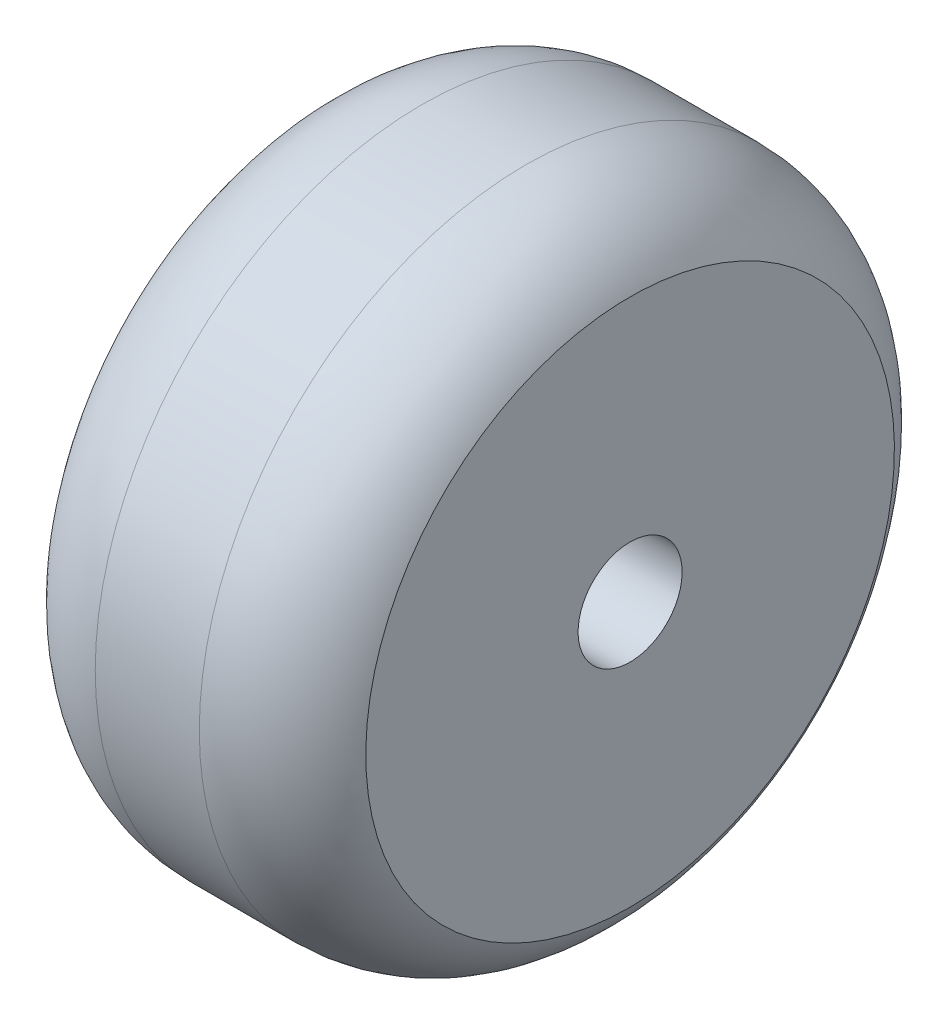
ISO-10303-21;
HEADER;
FILE_DESCRIPTION(('STEP AP214'),'2;1');
FILE_NAME('part.step','',(''),(''),'','','');
FILE_SCHEMA(('AUTOMOTIVE_DESIGN { 1 0 10303 214 1 1 1 1 }'));
ENDSEC;
DATA;
#1=APPLICATION_CONTEXT('core data for automotive mechanical design processes');
#2=APPLICATION_PROTOCOL_DEFINITION('international standard','automotive_design',2000,#1);
#3=PRODUCT_CONTEXT('',#1,'mechanical');
#4=PRODUCT('Part','Part','',(#3));
#5=PRODUCT_RELATED_PRODUCT_CATEGORY('part','',(#4));
#6=PRODUCT_DEFINITION_FORMATION('','',#4);
#7=PRODUCT_DEFINITION_CONTEXT('part definition',#1,'design');
#8=PRODUCT_DEFINITION('design','',#6,#7);
#9=PRODUCT_DEFINITION_SHAPE('','',#8);
#10=(LENGTH_UNIT() NAMED_UNIT(*) SI_UNIT(.MILLI.,.METRE.));
#11=(NAMED_UNIT(*) PLANE_ANGLE_UNIT() SI_UNIT($,.RADIAN.));
#12=(NAMED_UNIT(*) SI_UNIT($,.STERADIAN.) SOLID_ANGLE_UNIT());
#13=UNCERTAINTY_MEASURE_WITH_UNIT(LENGTH_MEASURE(1.E-05),#10,'distance_accuracy_value','');
#14=(GEOMETRIC_REPRESENTATION_CONTEXT(3) GLOBAL_UNCERTAINTY_ASSIGNED_CONTEXT((#13)) GLOBAL_UNIT_ASSIGNED_CONTEXT((#10,
#11,#12)) REPRESENTATION_CONTEXT('',''));
#15=CARTESIAN_POINT('',(0.,0.,0.));
#16=DIRECTION('',(0.,0.,1.));
#17=DIRECTION('',(1.,0.,0.));
#18=AXIS2_PLACEMENT_3D('',#15,#16,#17);
#19=CARTESIAN_POINT('',(-3.17500000000001,0.,0.));
#20=DIRECTION('',(-1.,0.,0.));
#21=DIRECTION('',(0.,-1.,0.));
#22=AXIS2_PLACEMENT_3D('',#19,#20,#21);
#23=TOROIDAL_SURFACE('',#22,12.7423333333334,7.19666666666665);
#24=CARTESIAN_POINT('',(-9.52499999999999,0.,0.));
#25=DIRECTION('',(-1.,0.,0.));
#26=DIRECTION('',(0.,-1.,0.));
#27=AXIS2_PLACEMENT_3D('',#24,#25,#26);
#28=CIRCLE('',#27,16.129);
#29=CARTESIAN_POINT('',(-9.52499999999998,-16.129,0.));
#30=VERTEX_POINT('',#29);
#31=EDGE_CURVE('E62',#30,#30,#28,.T.);
#32=ORIENTED_EDGE('',*,*,#31,.F.);
#33=EDGE_LOOP('',(#32));
#34=FACE_BOUND('',#33,.T.);
#35=CARTESIAN_POINT('',(-3.175,0.,0.));
#36=DIRECTION('',(-1.,0.,0.));
#37=DIRECTION('',(0.,-1.,0.));
#38=AXIS2_PLACEMENT_3D('',#35,#36,#37);
#39=CIRCLE('',#38,19.939);
#40=CARTESIAN_POINT('',(-3.17499999999999,-19.939,0.));
#41=VERTEX_POINT('',#40);
#42=EDGE_CURVE('E10',#41,#41,#39,.T.);
#43=ORIENTED_EDGE('',*,*,#42,.T.);
#44=EDGE_LOOP('',(#43));
#45=FACE_BOUND('',#44,.T.);
#46=ADVANCED_FACE('F45',(#34,#45),#23,.T.);
#47=CARTESIAN_POINT('',(-9.525,0.,0.));
#48=DIRECTION('',(-1.,0.,0.));
#49=DIRECTION('',(0.,-1.,0.));
#50=AXIS2_PLACEMENT_3D('',#47,#48,#49);
#51=CYLINDRICAL_SURFACE('',#50,19.939);
#52=CARTESIAN_POINT('',(3.175,0.,0.));
#53=DIRECTION('',(-1.,0.,0.));
#54=DIRECTION('',(0.,-1.,0.));
#55=AXIS2_PLACEMENT_3D('',#52,#53,#54);
#56=CIRCLE('',#55,19.939);
#57=CARTESIAN_POINT('',(3.17500000000001,-19.939,0.));
#58=VERTEX_POINT('',#57);
#59=EDGE_CURVE('E52',#58,#58,#56,.T.);
#60=ORIENTED_EDGE('',*,*,#59,.T.);
#61=EDGE_LOOP('',(#60));
#62=FACE_BOUND('',#61,.T.);
#63=ORIENTED_EDGE('',*,*,#42,.F.);
#64=EDGE_LOOP('',(#63));
#65=FACE_BOUND('',#64,.T.);
#66=ADVANCED_FACE('F95',(#62,#65),#51,.T.);
#67=CARTESIAN_POINT('',(3.17499999999999,0.,0.));
#68=DIRECTION('',(-1.,0.,0.));
#69=DIRECTION('',(0.,-1.,0.));
#70=AXIS2_PLACEMENT_3D('',#67,#68,#69);
#71=TOROIDAL_SURFACE('',#70,12.7423333333333,7.19666666666666);
#72=CARTESIAN_POINT('',(9.52499999999999,0.,0.));
#73=DIRECTION('',(-1.,0.,0.));
#74=DIRECTION('',(0.,-1.,0.));
#75=AXIS2_PLACEMENT_3D('',#72,#73,#74);
#76=CIRCLE('',#75,16.129);
#77=CARTESIAN_POINT('',(9.525,-16.129,0.));
#78=VERTEX_POINT('',#77);
#79=EDGE_CURVE('E57',#78,#78,#76,.T.);
#80=ORIENTED_EDGE('',*,*,#79,.T.);
#81=EDGE_LOOP('',(#80));
#82=FACE_BOUND('',#81,.T.);
#83=ORIENTED_EDGE('',*,*,#59,.F.);
#84=EDGE_LOOP('',(#83));
#85=FACE_BOUND('',#84,.T.);
#86=ADVANCED_FACE('F89',(#82,#85),#71,.T.);
#87=CARTESIAN_POINT('',(9.525,0.,0.));
#88=DIRECTION('',(1.,0.,0.));
#89=DIRECTION('',(0.,1.,0.));
#90=AXIS2_PLACEMENT_3D('',#87,#88,#89);
#91=PLANE('',#90);
#92=CARTESIAN_POINT('',(9.525,0.,0.));
#93=DIRECTION('',(1.,0.,0.));
#94=DIRECTION('',(0.,1.,0.));
#95=AXIS2_PLACEMENT_3D('',#92,#93,#94);
#96=CIRCLE('',#95,3.175);
#97=CARTESIAN_POINT('',(9.525,3.175,0.));
#98=VERTEX_POINT('',#97);
#99=EDGE_CURVE('E69',#98,#98,#96,.T.);
#100=ORIENTED_EDGE('',*,*,#99,.F.);
#101=EDGE_LOOP('',(#100));
#102=FACE_BOUND('',#101,.T.);
#103=ORIENTED_EDGE('',*,*,#79,.F.);
#104=EDGE_LOOP('',(#103));
#105=FACE_BOUND('',#104,.T.);
#106=ADVANCED_FACE('F86',(#102,#105),#91,.T.);
#107=CARTESIAN_POINT('',(-9.525,0.,0.));
#108=DIRECTION('',(1.,0.,0.));
#109=DIRECTION('',(0.,1.,0.));
#110=AXIS2_PLACEMENT_3D('',#107,#108,#109);
#111=PLANE('',#110);
#112=CARTESIAN_POINT('',(-9.52499999999999,0.,0.));
#113=DIRECTION('',(1.,0.,0.));
#114=DIRECTION('',(0.,1.,0.));
#115=AXIS2_PLACEMENT_3D('',#112,#113,#114);
#116=CIRCLE('',#115,3.175);
#117=CARTESIAN_POINT('',(-9.52499999999999,3.175,0.));
#118=VERTEX_POINT('',#117);
#119=EDGE_CURVE('E68',#118,#118,#116,.T.);
#120=ORIENTED_EDGE('',*,*,#119,.T.);
#121=EDGE_LOOP('',(#120));
#122=FACE_BOUND('',#121,.T.);
#123=ORIENTED_EDGE('',*,*,#31,.T.);
#124=EDGE_LOOP('',(#123));
#125=FACE_BOUND('',#124,.T.);
#126=ADVANCED_FACE('F77',(#122,#125),#111,.F.);
#127=CARTESIAN_POINT('',(-9.52499999999999,0.,0.));
#128=DIRECTION('',(1.,0.,0.));
#129=DIRECTION('',(0.,1.,0.));
#130=AXIS2_PLACEMENT_3D('',#127,#128,#129);
#131=CYLINDRICAL_SURFACE('',#130,3.175);
#132=ORIENTED_EDGE('',*,*,#119,.F.);
#133=EDGE_LOOP('',(#132));
#134=FACE_BOUND('',#133,.T.);
#135=ORIENTED_EDGE('',*,*,#99,.T.);
#136=EDGE_LOOP('',(#135));
#137=FACE_BOUND('',#136,.T.);
#138=ADVANCED_FACE('F80',(#134,#137),#131,.F.);
#139=CLOSED_SHELL('',(#46,#66,#86,#106,#126,#138));
#140=MANIFOLD_SOLID_BREP('B2',#139);
#141=ADVANCED_BREP_SHAPE_REPRESENTATION('',(#18,#140),#14);
#142=SHAPE_DEFINITION_REPRESENTATION(#9,#141);
ENDSEC;
END-ISO-10303-21;
